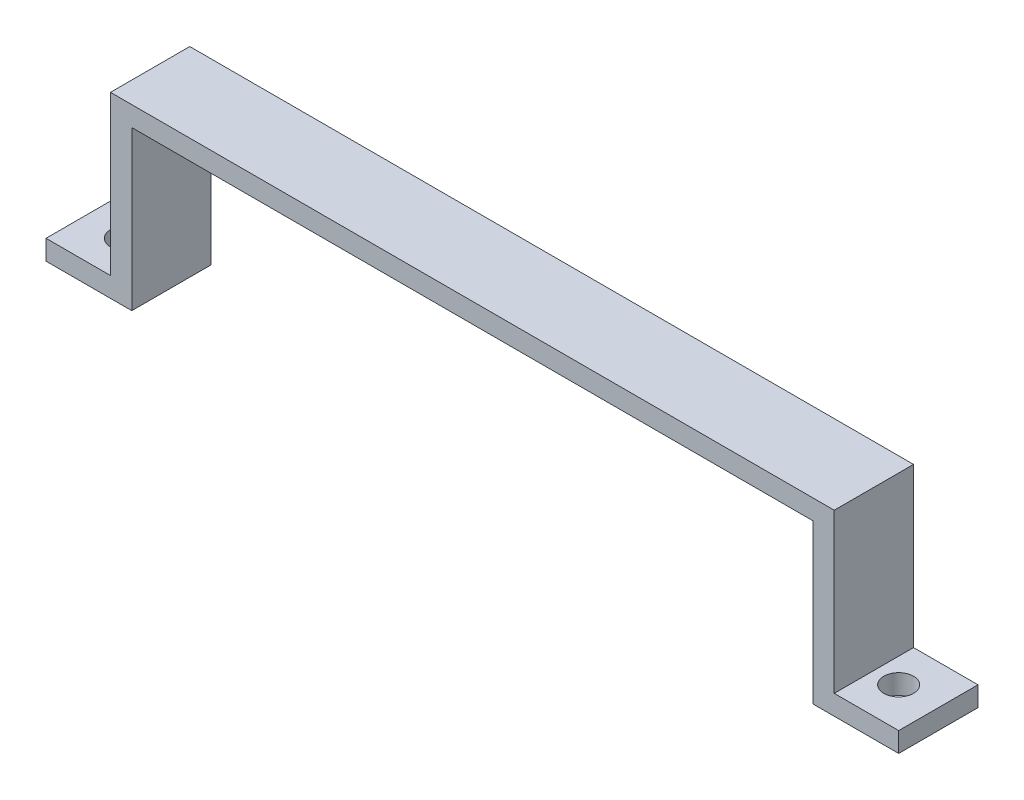
ISO-10303-21;
HEADER;
FILE_DESCRIPTION(('STEP AP214'),'2;1');
FILE_NAME('part.step','',(''),(''),'','','');
FILE_SCHEMA(('AUTOMOTIVE_DESIGN { 1 0 10303 214 1 1 1 1 }'));
ENDSEC;
DATA;
#1=APPLICATION_CONTEXT('core data for automotive mechanical design processes');
#2=APPLICATION_PROTOCOL_DEFINITION('international standard','automotive_design',2000,#1);
#3=PRODUCT_CONTEXT('',#1,'mechanical');
#4=PRODUCT('Part','Part','',(#3));
#5=PRODUCT_RELATED_PRODUCT_CATEGORY('part','',(#4));
#6=PRODUCT_DEFINITION_FORMATION('','',#4);
#7=PRODUCT_DEFINITION_CONTEXT('part definition',#1,'design');
#8=PRODUCT_DEFINITION('design','',#6,#7);
#9=PRODUCT_DEFINITION_SHAPE('','',#8);
#10=(LENGTH_UNIT() NAMED_UNIT(*) SI_UNIT(.MILLI.,.METRE.));
#11=(NAMED_UNIT(*) PLANE_ANGLE_UNIT() SI_UNIT($,.RADIAN.));
#12=(NAMED_UNIT(*) SI_UNIT($,.STERADIAN.) SOLID_ANGLE_UNIT());
#13=UNCERTAINTY_MEASURE_WITH_UNIT(LENGTH_MEASURE(1.E-05),#10,'distance_accuracy_value','');
#14=(GEOMETRIC_REPRESENTATION_CONTEXT(3) GLOBAL_UNCERTAINTY_ASSIGNED_CONTEXT((#13)) GLOBAL_UNIT_ASSIGNED_CONTEXT((#10,
#11,#12)) REPRESENTATION_CONTEXT('',''));
#15=CARTESIAN_POINT('',(0.,0.,0.));
#16=DIRECTION('',(0.,0.,1.));
#17=DIRECTION('',(1.,0.,0.));
#18=AXIS2_PLACEMENT_3D('',#15,#16,#17);
#19=CARTESIAN_POINT('',(0.,0.,0.));
#20=DIRECTION('',(0.,-1.,0.));
#21=DIRECTION('',(0.,0.,-1.));
#22=AXIS2_PLACEMENT_3D('',#19,#20,#21);
#23=PLANE('',#22);
#24=DIRECTION('',(1.,0.,0.));
#25=VECTOR('',#24,1.);
#26=CARTESIAN_POINT('',(-36.5,0.,-4.));
#27=LINE('',#26,#25);
#28=CARTESIAN_POINT('',(-34.35,0.,-4.));
#29=VERTEX_POINT('',#28);
#30=CARTESIAN_POINT('',(34.35,0.,-4.));
#31=VERTEX_POINT('',#30);
#32=EDGE_CURVE('E243',#29,#31,#27,.T.);
#33=ORIENTED_EDGE('',*,*,#32,.T.);
#34=DIRECTION('',(0.,0.,-1.));
#35=VECTOR('',#34,1.);
#36=CARTESIAN_POINT('',(34.35,0.,0.));
#37=LINE('',#36,#35);
#38=CARTESIAN_POINT('',(34.35,0.,4.));
#39=VERTEX_POINT('',#38);
#40=EDGE_CURVE('E213',#39,#31,#37,.T.);
#41=ORIENTED_EDGE('',*,*,#40,.F.);
#42=DIRECTION('',(1.,0.,0.));
#43=VECTOR('',#42,1.);
#44=CARTESIAN_POINT('',(-36.5,0.,4.));
#45=LINE('',#44,#43);
#46=CARTESIAN_POINT('',(-34.35,0.,4.));
#47=VERTEX_POINT('',#46);
#48=EDGE_CURVE('E250',#47,#39,#45,.T.);
#49=ORIENTED_EDGE('',*,*,#48,.F.);
#50=DIRECTION('',(0.,0.,1.));
#51=VECTOR('',#50,1.);
#52=CARTESIAN_POINT('',(-34.35,0.,0.));
#53=LINE('',#52,#51);
#54=EDGE_CURVE('E228',#29,#47,#53,.T.);
#55=ORIENTED_EDGE('',*,*,#54,.F.);
#56=EDGE_LOOP('',(#33,#41,#49,#55));
#57=FACE_BOUND('',#56,.T.);
#58=ADVANCED_FACE('F67',(#57),#23,.T.);
#59=CARTESIAN_POINT('',(-36.5,2.,4.));
#60=DIRECTION('',(-1.,0.,0.));
#61=DIRECTION('',(0.,0.,1.));
#62=AXIS2_PLACEMENT_3D('',#59,#60,#61);
#63=PLANE('',#62);
#64=DIRECTION('',(0.,0.,-1.));
#65=VECTOR('',#64,1.);
#66=CARTESIAN_POINT('',(-36.5,-14.,0.));
#67=LINE('',#66,#65);
#68=CARTESIAN_POINT('',(-36.5,-14.,4.));
#69=VERTEX_POINT('',#68);
#70=CARTESIAN_POINT('',(-36.5,-14.,-4.));
#71=VERTEX_POINT('',#70);
#72=EDGE_CURVE('E92',#69,#71,#67,.T.);
#73=ORIENTED_EDGE('',*,*,#72,.F.);
#74=DIRECTION('',(0.,-1.,0.));
#75=VECTOR('',#74,1.);
#76=CARTESIAN_POINT('',(-36.5,2.,4.));
#77=LINE('',#76,#75);
#78=CARTESIAN_POINT('',(-36.5,2.,4.));
#79=VERTEX_POINT('',#78);
#80=EDGE_CURVE('E12',#79,#69,#77,.T.);
#81=ORIENTED_EDGE('',*,*,#80,.F.);
#82=DIRECTION('',(0.,0.,-1.));
#83=VECTOR('',#82,1.);
#84=CARTESIAN_POINT('',(-36.5,2.,4.));
#85=LINE('',#84,#83);
#86=CARTESIAN_POINT('',(-36.5,2.,-4.));
#87=VERTEX_POINT('',#86);
#88=EDGE_CURVE('E246',#79,#87,#85,.T.);
#89=ORIENTED_EDGE('',*,*,#88,.T.);
#90=DIRECTION('',(0.,-1.,0.));
#91=VECTOR('',#90,1.);
#92=CARTESIAN_POINT('',(-36.5,2.,-4.));
#93=LINE('',#92,#91);
#94=EDGE_CURVE('E71',#87,#71,#93,.T.);
#95=ORIENTED_EDGE('',*,*,#94,.T.);
#96=EDGE_LOOP('',(#73,#81,#89,#95));
#97=FACE_BOUND('',#96,.T.);
#98=ADVANCED_FACE('F69',(#97),#63,.T.);
#99=CARTESIAN_POINT('',(-36.5,2.,4.));
#100=DIRECTION('',(0.,0.,-1.));
#101=DIRECTION('',(-1.,0.,0.));
#102=AXIS2_PLACEMENT_3D('',#99,#100,#101);
#103=PLANE('',#102);
#104=ORIENTED_EDGE('',*,*,#80,.T.);
#105=DIRECTION('',(1.,0.,0.));
#106=VECTOR('',#105,1.);
#107=CARTESIAN_POINT('',(0.,-14.,4.));
#108=LINE('',#107,#106);
#109=CARTESIAN_POINT('',(-43.,-14.,4.));
#110=VERTEX_POINT('',#109);
#111=EDGE_CURVE('E202',#110,#69,#108,.T.);
#112=ORIENTED_EDGE('',*,*,#111,.F.);
#113=DIRECTION('',(0.,-1.,0.));
#114=VECTOR('',#113,1.);
#115=CARTESIAN_POINT('',(-43.,-14.,4.));
#116=LINE('',#115,#114);
#117=CARTESIAN_POINT('',(-43.,-16.,4.));
#118=VERTEX_POINT('',#117);
#119=EDGE_CURVE('E207',#110,#118,#116,.T.);
#120=ORIENTED_EDGE('',*,*,#119,.T.);
#121=DIRECTION('',(1.,0.,0.));
#122=VECTOR('',#121,1.);
#123=CARTESIAN_POINT('',(0.,-16.,4.));
#124=LINE('',#123,#122);
#125=CARTESIAN_POINT('',(-34.35,-16.,4.));
#126=VERTEX_POINT('',#125);
#127=EDGE_CURVE('E234',#118,#126,#124,.T.);
#128=ORIENTED_EDGE('',*,*,#127,.T.);
#129=DIRECTION('',(0.,1.,0.));
#130=VECTOR('',#129,1.);
#131=CARTESIAN_POINT('',(-34.35,-16.,4.));
#132=LINE('',#131,#130);
#133=EDGE_CURVE('E240',#126,#47,#132,.T.);
#134=ORIENTED_EDGE('',*,*,#133,.T.);
#135=ORIENTED_EDGE('',*,*,#48,.T.);
#136=DIRECTION('',(0.,1.,0.));
#137=VECTOR('',#136,1.);
#138=CARTESIAN_POINT('',(34.35,-16.,4.));
#139=LINE('',#138,#137);
#140=CARTESIAN_POINT('',(34.35,-16.,4.));
#141=VERTEX_POINT('',#140);
#142=EDGE_CURVE('E223',#141,#39,#139,.T.);
#143=ORIENTED_EDGE('',*,*,#142,.F.);
#144=DIRECTION('',(1.,0.,0.));
#145=VECTOR('',#144,1.);
#146=CARTESIAN_POINT('',(0.,-16.,4.));
#147=LINE('',#146,#145);
#148=CARTESIAN_POINT('',(43.,-16.,4.));
#149=VERTEX_POINT('',#148);
#150=EDGE_CURVE('E219',#141,#149,#147,.T.);
#151=ORIENTED_EDGE('',*,*,#150,.T.);
#152=DIRECTION('',(0.,-1.,0.));
#153=VECTOR('',#152,1.);
#154=CARTESIAN_POINT('',(43.,-14.,4.));
#155=LINE('',#154,#153);
#156=CARTESIAN_POINT('',(43.,-14.,4.));
#157=VERTEX_POINT('',#156);
#158=EDGE_CURVE('E172',#157,#149,#155,.T.);
#159=ORIENTED_EDGE('',*,*,#158,.F.);
#160=DIRECTION('',(1.,0.,0.));
#161=VECTOR('',#160,1.);
#162=CARTESIAN_POINT('',(0.,-14.,4.));
#163=LINE('',#162,#161);
#164=CARTESIAN_POINT('',(36.5,-14.,4.));
#165=VERTEX_POINT('',#164);
#166=EDGE_CURVE('E160',#165,#157,#163,.T.);
#167=ORIENTED_EDGE('',*,*,#166,.F.);
#168=DIRECTION('',(0.,-1.,0.));
#169=VECTOR('',#168,1.);
#170=CARTESIAN_POINT('',(36.5,2.,4.));
#171=LINE('',#170,#169);
#172=CARTESIAN_POINT('',(36.5,2.,4.));
#173=VERTEX_POINT('',#172);
#174=EDGE_CURVE('E76',#173,#165,#171,.T.);
#175=ORIENTED_EDGE('',*,*,#174,.F.);
#176=DIRECTION('',(1.,0.,0.));
#177=VECTOR('',#176,1.);
#178=CARTESIAN_POINT('',(-36.5,2.,4.));
#179=LINE('',#178,#177);
#180=EDGE_CURVE('E254',#79,#173,#179,.T.);
#181=ORIENTED_EDGE('',*,*,#180,.F.);
#182=EDGE_LOOP('',(#104,#112,#120,#128,#134,#135,#143,#151,#159,#167,#175,#181));
#183=FACE_BOUND('',#182,.T.);
#184=ADVANCED_FACE('F275',(#183),#103,.F.);
#185=CARTESIAN_POINT('',(36.5,2.,4.));
#186=DIRECTION('',(-1.,0.,0.));
#187=DIRECTION('',(0.,0.,1.));
#188=AXIS2_PLACEMENT_3D('',#185,#186,#187);
#189=PLANE('',#188);
#190=ORIENTED_EDGE('',*,*,#174,.T.);
#191=DIRECTION('',(0.,0.,-1.));
#192=VECTOR('',#191,1.);
#193=CARTESIAN_POINT('',(36.5,-14.,0.));
#194=LINE('',#193,#192);
#195=CARTESIAN_POINT('',(36.5,-14.,-4.));
#196=VERTEX_POINT('',#195);
#197=EDGE_CURVE('E173',#165,#196,#194,.T.);
#198=ORIENTED_EDGE('',*,*,#197,.T.);
#199=DIRECTION('',(0.,-1.,0.));
#200=VECTOR('',#199,1.);
#201=CARTESIAN_POINT('',(36.5,2.,-4.));
#202=LINE('',#201,#200);
#203=CARTESIAN_POINT('',(36.5,2.,-4.));
#204=VERTEX_POINT('',#203);
#205=EDGE_CURVE('E180',#204,#196,#202,.T.);
#206=ORIENTED_EDGE('',*,*,#205,.F.);
#207=DIRECTION('',(0.,0.,-1.));
#208=VECTOR('',#207,1.);
#209=CARTESIAN_POINT('',(36.5,2.,4.));
#210=LINE('',#209,#208);
#211=EDGE_CURVE('E252',#173,#204,#210,.T.);
#212=ORIENTED_EDGE('',*,*,#211,.F.);
#213=EDGE_LOOP('',(#190,#198,#206,#212));
#214=FACE_BOUND('',#213,.T.);
#215=ADVANCED_FACE('F282',(#214),#189,.F.);
#216=CARTESIAN_POINT('',(-36.5,2.,-4.));
#217=DIRECTION('',(0.,0.,-1.));
#218=DIRECTION('',(-1.,0.,0.));
#219=AXIS2_PLACEMENT_3D('',#216,#217,#218);
#220=PLANE('',#219);
#221=ORIENTED_EDGE('',*,*,#32,.F.);
#222=DIRECTION('',(0.,1.,0.));
#223=VECTOR('',#222,1.);
#224=CARTESIAN_POINT('',(-34.35,-16.,-4.));
#225=LINE('',#224,#223);
#226=CARTESIAN_POINT('',(-34.35,-16.,-4.));
#227=VERTEX_POINT('',#226);
#228=EDGE_CURVE('E237',#227,#29,#225,.T.);
#229=ORIENTED_EDGE('',*,*,#228,.F.);
#230=DIRECTION('',(1.,0.,0.));
#231=VECTOR('',#230,1.);
#232=CARTESIAN_POINT('',(0.,-16.,-4.));
#233=LINE('',#232,#231);
#234=CARTESIAN_POINT('',(-43.,-16.,-4.));
#235=VERTEX_POINT('',#234);
#236=EDGE_CURVE('E232',#235,#227,#233,.T.);
#237=ORIENTED_EDGE('',*,*,#236,.F.);
#238=DIRECTION('',(0.,-1.,0.));
#239=VECTOR('',#238,1.);
#240=CARTESIAN_POINT('',(-43.,-14.,-4.));
#241=LINE('',#240,#239);
#242=CARTESIAN_POINT('',(-43.,-14.,-4.));
#243=VERTEX_POINT('',#242);
#244=EDGE_CURVE('E210',#243,#235,#241,.T.);
#245=ORIENTED_EDGE('',*,*,#244,.F.);
#246=DIRECTION('',(1.,0.,0.));
#247=VECTOR('',#246,1.);
#248=CARTESIAN_POINT('',(0.,-14.,-4.));
#249=LINE('',#248,#247);
#250=EDGE_CURVE('E198',#243,#71,#249,.T.);
#251=ORIENTED_EDGE('',*,*,#250,.T.);
#252=ORIENTED_EDGE('',*,*,#94,.F.);
#253=DIRECTION('',(1.,0.,0.));
#254=VECTOR('',#253,1.);
#255=CARTESIAN_POINT('',(-36.5,2.,-4.));
#256=LINE('',#255,#254);
#257=EDGE_CURVE('E249',#87,#204,#256,.T.);
#258=ORIENTED_EDGE('',*,*,#257,.T.);
#259=ORIENTED_EDGE('',*,*,#205,.T.);
#260=DIRECTION('',(1.,0.,0.));
#261=VECTOR('',#260,1.);
#262=CARTESIAN_POINT('',(0.,-14.,-4.));
#263=LINE('',#262,#261);
#264=CARTESIAN_POINT('',(43.,-14.,-4.));
#265=VERTEX_POINT('',#264);
#266=EDGE_CURVE('E84',#196,#265,#263,.T.);
#267=ORIENTED_EDGE('',*,*,#266,.T.);
#268=DIRECTION('',(0.,-1.,0.));
#269=VECTOR('',#268,1.);
#270=CARTESIAN_POINT('',(43.,-14.,-4.));
#271=LINE('',#270,#269);
#272=CARTESIAN_POINT('',(43.,-16.,-4.));
#273=VERTEX_POINT('',#272);
#274=EDGE_CURVE('E167',#265,#273,#271,.T.);
#275=ORIENTED_EDGE('',*,*,#274,.T.);
#276=DIRECTION('',(1.,0.,0.));
#277=VECTOR('',#276,1.);
#278=CARTESIAN_POINT('',(0.,-16.,-4.));
#279=LINE('',#278,#277);
#280=CARTESIAN_POINT('',(34.35,-16.,-4.));
#281=VERTEX_POINT('',#280);
#282=EDGE_CURVE('E221',#281,#273,#279,.T.);
#283=ORIENTED_EDGE('',*,*,#282,.F.);
#284=DIRECTION('',(0.,1.,0.));
#285=VECTOR('',#284,1.);
#286=CARTESIAN_POINT('',(34.35,-16.,-4.));
#287=LINE('',#286,#285);
#288=EDGE_CURVE('E226',#281,#31,#287,.T.);
#289=ORIENTED_EDGE('',*,*,#288,.T.);
#290=EDGE_LOOP('',(#221,#229,#237,#245,#251,#252,#258,#259,#267,#275,#283,#289));
#291=FACE_BOUND('',#290,.T.);
#292=ADVANCED_FACE('F177',(#291),#220,.T.);
#293=CARTESIAN_POINT('',(0.,2.,0.));
#294=DIRECTION('',(0.,-1.,0.));
#295=DIRECTION('',(0.,0.,-1.));
#296=AXIS2_PLACEMENT_3D('',#293,#294,#295);
#297=PLANE('',#296);
#298=ORIENTED_EDGE('',*,*,#88,.F.);
#299=ORIENTED_EDGE('',*,*,#180,.T.);
#300=ORIENTED_EDGE('',*,*,#211,.T.);
#301=ORIENTED_EDGE('',*,*,#257,.F.);
#302=EDGE_LOOP('',(#298,#299,#300,#301));
#303=FACE_BOUND('',#302,.T.);
#304=ADVANCED_FACE('F280',(#303),#297,.F.);
#305=CARTESIAN_POINT('',(-34.35,-16.,0.));
#306=DIRECTION('',(-1.,0.,0.));
#307=DIRECTION('',(0.,0.,1.));
#308=AXIS2_PLACEMENT_3D('',#305,#306,#307);
#309=PLANE('',#308);
#310=ORIENTED_EDGE('',*,*,#54,.T.);
#311=ORIENTED_EDGE('',*,*,#133,.F.);
#312=DIRECTION('',(0.,0.,1.));
#313=VECTOR('',#312,1.);
#314=CARTESIAN_POINT('',(-34.35,-16.,0.));
#315=LINE('',#314,#313);
#316=EDGE_CURVE('E230',#227,#126,#315,.T.);
#317=ORIENTED_EDGE('',*,*,#316,.F.);
#318=ORIENTED_EDGE('',*,*,#228,.T.);
#319=EDGE_LOOP('',(#310,#311,#317,#318));
#320=FACE_BOUND('',#319,.T.);
#321=ADVANCED_FACE('F299',(#320),#309,.F.);
#322=CARTESIAN_POINT('',(0.,-16.,0.));
#323=DIRECTION('',(0.,1.,0.));
#324=DIRECTION('',(0.,0.,1.));
#325=AXIS2_PLACEMENT_3D('',#322,#323,#324);
#326=PLANE('',#325);
#327=ORIENTED_EDGE('',*,*,#316,.T.);
#328=ORIENTED_EDGE('',*,*,#127,.F.);
#329=DIRECTION('',(0.,0.,1.));
#330=VECTOR('',#329,1.);
#331=CARTESIAN_POINT('',(-43.,-16.,0.));
#332=LINE('',#331,#330);
#333=EDGE_CURVE('E195',#235,#118,#332,.T.);
#334=ORIENTED_EDGE('',*,*,#333,.F.);
#335=ORIENTED_EDGE('',*,*,#236,.T.);
#336=EDGE_LOOP('',(#327,#328,#334,#335));
#337=FACE_BOUND('',#336,.T.);
#338=CARTESIAN_POINT('',(-39.,-16.,0.));
#339=DIRECTION('',(0.,1.,0.));
#340=DIRECTION('',(0.,0.,1.));
#341=AXIS2_PLACEMENT_3D('',#338,#339,#340);
#342=CIRCLE('',#341,1.5);
#343=CARTESIAN_POINT('',(-39.,-16.,1.50000000000001));
#344=VERTEX_POINT('',#343);
#345=EDGE_CURVE('E190',#344,#344,#342,.T.);
#346=ORIENTED_EDGE('',*,*,#345,.T.);
#347=EDGE_LOOP('',(#346));
#348=FACE_BOUND('',#347,.T.);
#349=ADVANCED_FACE('F302',(#337,#348),#326,.F.);
#350=CARTESIAN_POINT('',(34.35,-16.,0.));
#351=DIRECTION('',(1.,0.,0.));
#352=DIRECTION('',(0.,0.,-1.));
#353=AXIS2_PLACEMENT_3D('',#350,#351,#352);
#354=PLANE('',#353);
#355=ORIENTED_EDGE('',*,*,#40,.T.);
#356=ORIENTED_EDGE('',*,*,#288,.F.);
#357=DIRECTION('',(0.,0.,-1.));
#358=VECTOR('',#357,1.);
#359=CARTESIAN_POINT('',(34.35,-16.,0.));
#360=LINE('',#359,#358);
#361=EDGE_CURVE('E216',#141,#281,#360,.T.);
#362=ORIENTED_EDGE('',*,*,#361,.F.);
#363=ORIENTED_EDGE('',*,*,#142,.T.);
#364=EDGE_LOOP('',(#355,#356,#362,#363));
#365=FACE_BOUND('',#364,.T.);
#366=ADVANCED_FACE('F306',(#365),#354,.F.);
#367=CARTESIAN_POINT('',(0.,-16.,0.));
#368=DIRECTION('',(0.,1.,0.));
#369=DIRECTION('',(0.,0.,1.));
#370=AXIS2_PLACEMENT_3D('',#367,#368,#369);
#371=PLANE('',#370);
#372=ORIENTED_EDGE('',*,*,#361,.T.);
#373=ORIENTED_EDGE('',*,*,#282,.T.);
#374=DIRECTION('',(0.,0.,-1.));
#375=VECTOR('',#374,1.);
#376=CARTESIAN_POINT('',(43.,-16.,0.));
#377=LINE('',#376,#375);
#378=EDGE_CURVE('E170',#149,#273,#377,.T.);
#379=ORIENTED_EDGE('',*,*,#378,.F.);
#380=ORIENTED_EDGE('',*,*,#150,.F.);
#381=EDGE_LOOP('',(#372,#373,#379,#380));
#382=FACE_BOUND('',#381,.T.);
#383=CARTESIAN_POINT('',(39.,-16.,0.));
#384=DIRECTION('',(0.,1.,0.));
#385=DIRECTION('',(0.,0.,1.));
#386=AXIS2_PLACEMENT_3D('',#383,#384,#385);
#387=CIRCLE('',#386,1.5);
#388=CARTESIAN_POINT('',(39.,-16.,1.5));
#389=VERTEX_POINT('',#388);
#390=EDGE_CURVE('E185',#389,#389,#387,.T.);
#391=ORIENTED_EDGE('',*,*,#390,.T.);
#392=EDGE_LOOP('',(#391));
#393=FACE_BOUND('',#392,.T.);
#394=ADVANCED_FACE('F310',(#382,#393),#371,.F.);
#395=CARTESIAN_POINT('',(0.,-14.,0.));
#396=DIRECTION('',(0.,1.,0.));
#397=DIRECTION('',(0.,0.,1.));
#398=AXIS2_PLACEMENT_3D('',#395,#396,#397);
#399=PLANE('',#398);
#400=ORIENTED_EDGE('',*,*,#250,.F.);
#401=DIRECTION('',(0.,0.,1.));
#402=VECTOR('',#401,1.);
#403=CARTESIAN_POINT('',(-43.,-14.,0.));
#404=LINE('',#403,#402);
#405=EDGE_CURVE('E205',#243,#110,#404,.T.);
#406=ORIENTED_EDGE('',*,*,#405,.T.);
#407=ORIENTED_EDGE('',*,*,#111,.T.);
#408=ORIENTED_EDGE('',*,*,#72,.T.);
#409=EDGE_LOOP('',(#400,#406,#407,#408));
#410=FACE_BOUND('',#409,.T.);
#411=CARTESIAN_POINT('',(-39.,-14.,0.));
#412=DIRECTION('',(0.,1.,0.));
#413=DIRECTION('',(0.,0.,1.));
#414=AXIS2_PLACEMENT_3D('',#411,#412,#413);
#415=CIRCLE('',#414,1.5);
#416=CARTESIAN_POINT('',(-39.,-14.,1.50000000000001));
#417=VERTEX_POINT('',#416);
#418=EDGE_CURVE('E192',#417,#417,#415,.T.);
#419=ORIENTED_EDGE('',*,*,#418,.F.);
#420=EDGE_LOOP('',(#419));
#421=FACE_BOUND('',#420,.T.);
#422=ADVANCED_FACE('F265',(#410,#421),#399,.T.);
#423=CARTESIAN_POINT('',(-43.,-14.,0.));
#424=DIRECTION('',(1.,0.,0.));
#425=DIRECTION('',(0.,0.,-1.));
#426=AXIS2_PLACEMENT_3D('',#423,#424,#425);
#427=PLANE('',#426);
#428=ORIENTED_EDGE('',*,*,#333,.T.);
#429=ORIENTED_EDGE('',*,*,#119,.F.);
#430=ORIENTED_EDGE('',*,*,#405,.F.);
#431=ORIENTED_EDGE('',*,*,#244,.T.);
#432=EDGE_LOOP('',(#428,#429,#430,#431));
#433=FACE_BOUND('',#432,.T.);
#434=ADVANCED_FACE('F273',(#433),#427,.F.);
#435=CARTESIAN_POINT('',(-39.,-14.,0.));
#436=DIRECTION('',(0.,-1.,0.));
#437=DIRECTION('',(0.,0.,-1.));
#438=AXIS2_PLACEMENT_3D('',#435,#436,#437);
#439=CYLINDRICAL_SURFACE('',#438,1.5);
#440=ORIENTED_EDGE('',*,*,#418,.T.);
#441=EDGE_LOOP('',(#440));
#442=FACE_BOUND('',#441,.T.);
#443=ORIENTED_EDGE('',*,*,#345,.F.);
#444=EDGE_LOOP('',(#443));
#445=FACE_BOUND('',#444,.T.);
#446=ADVANCED_FACE('F317',(#442,#445),#439,.F.);
#447=CARTESIAN_POINT('',(0.,-14.,0.));
#448=DIRECTION('',(0.,1.,0.));
#449=DIRECTION('',(0.,0.,1.));
#450=AXIS2_PLACEMENT_3D('',#447,#448,#449);
#451=PLANE('',#450);
#452=ORIENTED_EDGE('',*,*,#266,.F.);
#453=ORIENTED_EDGE('',*,*,#197,.F.);
#454=ORIENTED_EDGE('',*,*,#166,.T.);
#455=DIRECTION('',(0.,0.,-1.));
#456=VECTOR('',#455,1.);
#457=CARTESIAN_POINT('',(43.,-14.,0.));
#458=LINE('',#457,#456);
#459=EDGE_CURVE('E156',#157,#265,#458,.T.);
#460=ORIENTED_EDGE('',*,*,#459,.T.);
#461=EDGE_LOOP('',(#452,#453,#454,#460));
#462=FACE_BOUND('',#461,.T.);
#463=CARTESIAN_POINT('',(39.,-14.,0.));
#464=DIRECTION('',(0.,1.,0.));
#465=DIRECTION('',(0.,0.,1.));
#466=AXIS2_PLACEMENT_3D('',#463,#464,#465);
#467=CIRCLE('',#466,1.5);
#468=CARTESIAN_POINT('',(39.,-14.,1.5));
#469=VERTEX_POINT('',#468);
#470=EDGE_CURVE('E182',#469,#469,#467,.T.);
#471=ORIENTED_EDGE('',*,*,#470,.F.);
#472=EDGE_LOOP('',(#471));
#473=FACE_BOUND('',#472,.T.);
#474=ADVANCED_FACE('F158',(#462,#473),#451,.T.);
#475=CARTESIAN_POINT('',(43.,-14.,0.));
#476=DIRECTION('',(-1.,0.,0.));
#477=DIRECTION('',(0.,0.,1.));
#478=AXIS2_PLACEMENT_3D('',#475,#476,#477);
#479=PLANE('',#478);
#480=ORIENTED_EDGE('',*,*,#378,.T.);
#481=ORIENTED_EDGE('',*,*,#274,.F.);
#482=ORIENTED_EDGE('',*,*,#459,.F.);
#483=ORIENTED_EDGE('',*,*,#158,.T.);
#484=EDGE_LOOP('',(#480,#481,#482,#483));
#485=FACE_BOUND('',#484,.T.);
#486=ADVANCED_FACE('F168',(#485),#479,.F.);
#487=CARTESIAN_POINT('',(39.,-14.,0.));
#488=DIRECTION('',(0.,-1.,0.));
#489=DIRECTION('',(0.,0.,-1.));
#490=AXIS2_PLACEMENT_3D('',#487,#488,#489);
#491=CYLINDRICAL_SURFACE('',#490,1.5);
#492=ORIENTED_EDGE('',*,*,#470,.T.);
#493=EDGE_LOOP('',(#492));
#494=FACE_BOUND('',#493,.T.);
#495=ORIENTED_EDGE('',*,*,#390,.F.);
#496=EDGE_LOOP('',(#495));
#497=FACE_BOUND('',#496,.T.);
#498=ADVANCED_FACE('F325',(#494,#497),#491,.F.);
#499=CLOSED_SHELL('',(#58,#98,#184,#215,#292,#304,#321,#349,#366,#394,#422,#434,#446,#474,#486,#498));
#500=MANIFOLD_SOLID_BREP('B2',#499);
#501=ADVANCED_BREP_SHAPE_REPRESENTATION('',(#18,#500),#14);
#502=SHAPE_DEFINITION_REPRESENTATION(#9,#501);
ENDSEC;
END-ISO-10303-21;
